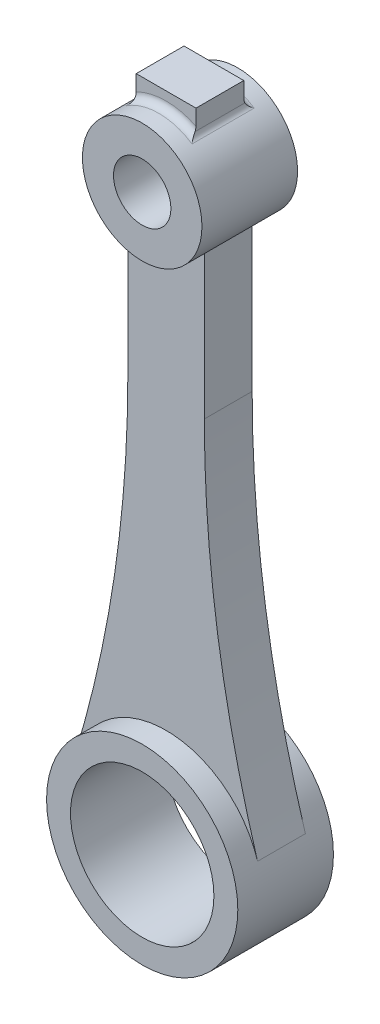
ISO-10303-21;
HEADER;
FILE_DESCRIPTION(('STEP AP214'),'2;1');
FILE_NAME('part.step','',(''),(''),'','','');
FILE_SCHEMA(('AUTOMOTIVE_DESIGN { 1 0 10303 214 1 1 1 1 }'));
ENDSEC;
DATA;
#1=APPLICATION_CONTEXT('core data for automotive mechanical design processes');
#2=APPLICATION_PROTOCOL_DEFINITION('international standard','automotive_design',2000,#1);
#3=PRODUCT_CONTEXT('',#1,'mechanical');
#4=PRODUCT('Part','Part','',(#3));
#5=PRODUCT_RELATED_PRODUCT_CATEGORY('part','',(#4));
#6=PRODUCT_DEFINITION_FORMATION('','',#4);
#7=PRODUCT_DEFINITION_CONTEXT('part definition',#1,'design');
#8=PRODUCT_DEFINITION('design','',#6,#7);
#9=PRODUCT_DEFINITION_SHAPE('','',#8);
#10=(LENGTH_UNIT() NAMED_UNIT(*) SI_UNIT(.MILLI.,.METRE.));
#11=(NAMED_UNIT(*) PLANE_ANGLE_UNIT() SI_UNIT($,.RADIAN.));
#12=(NAMED_UNIT(*) SI_UNIT($,.STERADIAN.) SOLID_ANGLE_UNIT());
#13=UNCERTAINTY_MEASURE_WITH_UNIT(LENGTH_MEASURE(1.E-05),#10,'distance_accuracy_value','');
#14=(GEOMETRIC_REPRESENTATION_CONTEXT(3) GLOBAL_UNCERTAINTY_ASSIGNED_CONTEXT((#13)) GLOBAL_UNIT_ASSIGNED_CONTEXT((#10,
#11,#12)) REPRESENTATION_CONTEXT('',''));
#15=CARTESIAN_POINT('',(0.,0.,0.));
#16=DIRECTION('',(0.,0.,1.));
#17=DIRECTION('',(1.,0.,0.));
#18=AXIS2_PLACEMENT_3D('',#15,#16,#17);
#19=CARTESIAN_POINT('',(0.,0.,10.));
#20=DIRECTION('',(0.,0.,1.));
#21=DIRECTION('',(1.,0.,0.));
#22=AXIS2_PLACEMENT_3D('',#19,#20,#21);
#23=PLANE('',#22);
#24=CARTESIAN_POINT('',(0.,0.,10.));
#25=DIRECTION('',(0.,0.,1.));
#26=DIRECTION('',(1.,0.,0.));
#27=AXIS2_PLACEMENT_3D('',#24,#25,#26);
#28=CIRCLE('',#27,20.);
#29=CARTESIAN_POINT('',(20.,0.,10.));
#30=VERTEX_POINT('',#29);
#31=EDGE_CURVE('E234',#30,#30,#28,.T.);
#32=ORIENTED_EDGE('',*,*,#31,.T.);
#33=EDGE_LOOP('',(#32));
#34=FACE_BOUND('',#33,.T.);
#35=CARTESIAN_POINT('',(0.,0.,10.));
#36=DIRECTION('',(0.,0.,1.));
#37=DIRECTION('',(1.,0.,0.));
#38=AXIS2_PLACEMENT_3D('',#35,#36,#37);
#39=CIRCLE('',#38,15.);
#40=CARTESIAN_POINT('',(15.,0.,10.));
#41=VERTEX_POINT('',#40);
#42=EDGE_CURVE('E228',#41,#41,#39,.T.);
#43=ORIENTED_EDGE('',*,*,#42,.F.);
#44=EDGE_LOOP('',(#43));
#45=FACE_BOUND('',#44,.T.);
#46=ADVANCED_FACE('F34',(#34,#45),#23,.T.);
#47=CARTESIAN_POINT('',(0.,0.,-10.));
#48=DIRECTION('',(0.,0.,1.));
#49=DIRECTION('',(1.,0.,0.));
#50=AXIS2_PLACEMENT_3D('',#47,#48,#49);
#51=PLANE('',#50);
#52=CARTESIAN_POINT('',(0.,0.,-10.));
#53=DIRECTION('',(0.,0.,1.));
#54=DIRECTION('',(1.,0.,0.));
#55=AXIS2_PLACEMENT_3D('',#52,#53,#54);
#56=CIRCLE('',#55,20.);
#57=CARTESIAN_POINT('',(20.,0.,-10.));
#58=VERTEX_POINT('',#57);
#59=EDGE_CURVE('E231',#58,#58,#56,.T.);
#60=ORIENTED_EDGE('',*,*,#59,.F.);
#61=EDGE_LOOP('',(#60));
#62=FACE_BOUND('',#61,.T.);
#63=CARTESIAN_POINT('',(0.,0.,-10.));
#64=DIRECTION('',(0.,0.,1.));
#65=DIRECTION('',(1.,0.,0.));
#66=AXIS2_PLACEMENT_3D('',#63,#64,#65);
#67=CIRCLE('',#66,15.);
#68=CARTESIAN_POINT('',(15.,0.,-10.));
#69=VERTEX_POINT('',#68);
#70=EDGE_CURVE('E227',#69,#69,#67,.T.);
#71=ORIENTED_EDGE('',*,*,#70,.T.);
#72=EDGE_LOOP('',(#71));
#73=FACE_BOUND('',#72,.T.);
#74=ADVANCED_FACE('F388',(#62,#73),#51,.F.);
#75=CARTESIAN_POINT('',(0.,0.,10.));
#76=DIRECTION('',(0.,0.,-1.));
#77=DIRECTION('',(-1.,0.,0.));
#78=AXIS2_PLACEMENT_3D('',#75,#76,#77);
#79=CYLINDRICAL_SURFACE('',#78,20.);
#80=DIRECTION('',(0.,0.,-1.));
#81=VECTOR('',#80,1.);
#82=CARTESIAN_POINT('',(19.1282509955381,5.84037788603577,5.));
#83=LINE('',#82,#81);
#84=CARTESIAN_POINT('',(19.1282509955381,5.84037788603577,5.));
#85=VERTEX_POINT('',#84);
#86=CARTESIAN_POINT('',(19.128250995538,5.84037788603575,-5.));
#87=VERTEX_POINT('',#86);
#88=EDGE_CURVE('E197',#85,#87,#83,.T.);
#89=ORIENTED_EDGE('',*,*,#88,.F.);
#90=CARTESIAN_POINT('',(0.,0.,5.));
#91=DIRECTION('',(0.,0.,-1.));
#92=DIRECTION('',(1.,0.,0.));
#93=AXIS2_PLACEMENT_3D('',#90,#91,#92);
#94=CIRCLE('',#93,20.);
#95=CARTESIAN_POINT('',(-19.1282509955381,5.84037788603577,5.));
#96=VERTEX_POINT('',#95);
#97=EDGE_CURVE('E194',#96,#85,#94,.T.);
#98=ORIENTED_EDGE('',*,*,#97,.F.);
#99=DIRECTION('',(0.,0.,-1.));
#100=VECTOR('',#99,1.);
#101=CARTESIAN_POINT('',(-19.128250995538,5.84037788603586,5.));
#102=LINE('',#101,#100);
#103=CARTESIAN_POINT('',(-19.128250995538,5.84037788603586,-5.));
#104=VERTEX_POINT('',#103);
#105=EDGE_CURVE('E213',#96,#104,#102,.T.);
#106=ORIENTED_EDGE('',*,*,#105,.T.);
#107=CARTESIAN_POINT('',(0.,0.,-5.));
#108=DIRECTION('',(0.,0.,-1.));
#109=DIRECTION('',(1.,0.,0.));
#110=AXIS2_PLACEMENT_3D('',#107,#108,#109);
#111=CIRCLE('',#110,20.);
#112=EDGE_CURVE('E185',#104,#87,#111,.T.);
#113=ORIENTED_EDGE('',*,*,#112,.T.);
#114=EDGE_LOOP('',(#89,#98,#106,#113));
#115=FACE_BOUND('',#114,.T.);
#116=ORIENTED_EDGE('',*,*,#31,.F.);
#117=EDGE_LOOP('',(#116));
#118=FACE_BOUND('',#117,.T.);
#119=ORIENTED_EDGE('',*,*,#59,.T.);
#120=EDGE_LOOP('',(#119));
#121=FACE_BOUND('',#120,.T.);
#122=ADVANCED_FACE('F384',(#115,#118,#121),#79,.T.);
#123=CARTESIAN_POINT('',(0.,0.,10.));
#124=DIRECTION('',(0.,0.,-1.));
#125=DIRECTION('',(-1.,0.,0.));
#126=AXIS2_PLACEMENT_3D('',#123,#124,#125);
#127=CYLINDRICAL_SURFACE('',#126,15.);
#128=ORIENTED_EDGE('',*,*,#42,.T.);
#129=EDGE_LOOP('',(#128));
#130=FACE_BOUND('',#129,.T.);
#131=ORIENTED_EDGE('',*,*,#70,.F.);
#132=EDGE_LOOP('',(#131));
#133=FACE_BOUND('',#132,.T.);
#134=ADVANCED_FACE('F380',(#130,#133),#127,.F.);
#135=CARTESIAN_POINT('',(263.308602328881,80.3953136438508,5.));
#136=DIRECTION('',(0.,0.,-1.));
#137=DIRECTION('',(-1.,0.,0.));
#138=AXIS2_PLACEMENT_3D('',#135,#136,#137);
#139=CYLINDRICAL_SURFACE('',#138,255.308602328881);
#140=CARTESIAN_POINT('',(263.308602328881,80.3953136438508,-5.));
#141=DIRECTION('',(0.,0.,-1.));
#142=DIRECTION('',(1.,0.,0.));
#143=AXIS2_PLACEMENT_3D('',#140,#141,#142);
#144=CIRCLE('',#143,255.308602328881);
#145=CARTESIAN_POINT('',(8.00000000000001,80.3953136438507,-5.));
#146=VERTEX_POINT('',#145);
#147=EDGE_CURVE('E178',#87,#146,#144,.T.);
#148=ORIENTED_EDGE('',*,*,#147,.T.);
#149=DIRECTION('',(0.,0.,-1.));
#150=VECTOR('',#149,1.);
#151=CARTESIAN_POINT('',(8.00000000000001,80.3953136438507,5.));
#152=LINE('',#151,#150);
#153=CARTESIAN_POINT('',(8.00000000000001,80.3953136438507,5.));
#154=VERTEX_POINT('',#153);
#155=EDGE_CURVE('E224',#154,#146,#152,.T.);
#156=ORIENTED_EDGE('',*,*,#155,.F.);
#157=CARTESIAN_POINT('',(263.308602328881,80.3953136438508,5.));
#158=DIRECTION('',(0.,0.,-1.));
#159=DIRECTION('',(1.,0.,0.));
#160=AXIS2_PLACEMENT_3D('',#157,#158,#159);
#161=CIRCLE('',#160,255.308602328881);
#162=EDGE_CURVE('E181',#85,#154,#161,.T.);
#163=ORIENTED_EDGE('',*,*,#162,.F.);
#164=ORIENTED_EDGE('',*,*,#88,.T.);
#165=EDGE_LOOP('',(#148,#156,#163,#164));
#166=FACE_BOUND('',#165,.T.);
#167=ADVANCED_FACE('F376',(#166),#139,.F.);
#168=CARTESIAN_POINT('',(8.,110.395313643851,5.));
#169=DIRECTION('',(-1.,0.,0.));
#170=DIRECTION('',(0.,-1.,0.));
#171=AXIS2_PLACEMENT_3D('',#168,#169,#170);
#172=PLANE('',#171);
#173=DIRECTION('',(0.,1.,0.));
#174=VECTOR('',#173,1.);
#175=CARTESIAN_POINT('',(8.,110.395313643851,-5.));
#176=LINE('',#175,#174);
#177=CARTESIAN_POINT('',(8.,110.395313643851,-5.));
#178=VERTEX_POINT('',#177);
#179=EDGE_CURVE('E200',#146,#178,#176,.T.);
#180=ORIENTED_EDGE('',*,*,#179,.T.);
#181=DIRECTION('',(0.,0.,-1.));
#182=VECTOR('',#181,1.);
#183=CARTESIAN_POINT('',(8.,110.395313643851,5.));
#184=LINE('',#183,#182);
#185=CARTESIAN_POINT('',(8.,110.395313643851,5.));
#186=VERTEX_POINT('',#185);
#187=EDGE_CURVE('E221',#186,#178,#184,.T.);
#188=ORIENTED_EDGE('',*,*,#187,.F.);
#189=DIRECTION('',(0.,1.,0.));
#190=VECTOR('',#189,1.);
#191=CARTESIAN_POINT('',(8.,110.395313643851,5.));
#192=LINE('',#191,#190);
#193=EDGE_CURVE('E184',#154,#186,#192,.T.);
#194=ORIENTED_EDGE('',*,*,#193,.F.);
#195=ORIENTED_EDGE('',*,*,#155,.T.);
#196=EDGE_LOOP('',(#180,#188,#194,#195));
#197=FACE_BOUND('',#196,.T.);
#198=ADVANCED_FACE('F372',(#197),#172,.F.);
#199=CARTESIAN_POINT('',(-8.,110.395313643851,5.));
#200=DIRECTION('',(1.,0.,0.));
#201=DIRECTION('',(0.,1.,0.));
#202=AXIS2_PLACEMENT_3D('',#199,#200,#201);
#203=PLANE('',#202);
#204=DIRECTION('',(0.,-1.,0.));
#205=VECTOR('',#204,1.);
#206=CARTESIAN_POINT('',(-8.,110.395313643851,-5.));
#207=LINE('',#206,#205);
#208=CARTESIAN_POINT('',(-8.,110.395313643851,-5.));
#209=VERTEX_POINT('',#208);
#210=CARTESIAN_POINT('',(-8.00000000000001,80.3953136438507,-5.));
#211=VERTEX_POINT('',#210);
#212=EDGE_CURVE('E205',#209,#211,#207,.T.);
#213=ORIENTED_EDGE('',*,*,#212,.T.);
#214=DIRECTION('',(0.,0.,-1.));
#215=VECTOR('',#214,1.);
#216=CARTESIAN_POINT('',(-8.00000000000001,80.3953136438507,5.));
#217=LINE('',#216,#215);
#218=CARTESIAN_POINT('',(-8.00000000000001,80.3953136438507,5.));
#219=VERTEX_POINT('',#218);
#220=EDGE_CURVE('E215',#219,#211,#217,.T.);
#221=ORIENTED_EDGE('',*,*,#220,.F.);
#222=DIRECTION('',(0.,-1.,0.));
#223=VECTOR('',#222,1.);
#224=CARTESIAN_POINT('',(-8.,110.395313643851,5.));
#225=LINE('',#224,#223);
#226=CARTESIAN_POINT('',(-8.,110.395313643851,5.));
#227=VERTEX_POINT('',#226);
#228=EDGE_CURVE('E189',#227,#219,#225,.T.);
#229=ORIENTED_EDGE('',*,*,#228,.F.);
#230=DIRECTION('',(0.,0.,-1.));
#231=VECTOR('',#230,1.);
#232=CARTESIAN_POINT('',(-8.,110.395313643851,5.));
#233=LINE('',#232,#231);
#234=EDGE_CURVE('E218',#227,#209,#233,.T.);
#235=ORIENTED_EDGE('',*,*,#234,.T.);
#236=EDGE_LOOP('',(#213,#221,#229,#235));
#237=FACE_BOUND('',#236,.T.);
#238=ADVANCED_FACE('F368',(#237),#203,.F.);
#239=CARTESIAN_POINT('',(-263.308602328881,80.3953136438508,5.));
#240=DIRECTION('',(0.,0.,-1.));
#241=DIRECTION('',(-1.,0.,0.));
#242=AXIS2_PLACEMENT_3D('',#239,#240,#241);
#243=CYLINDRICAL_SURFACE('',#242,255.308602328881);
#244=CARTESIAN_POINT('',(-263.308602328881,80.3953136438508,-5.));
#245=DIRECTION('',(0.,0.,-1.));
#246=DIRECTION('',(-1.,0.,0.));
#247=AXIS2_PLACEMENT_3D('',#244,#245,#246);
#248=CIRCLE('',#247,255.308602328881);
#249=EDGE_CURVE('E207',#211,#104,#248,.T.);
#250=ORIENTED_EDGE('',*,*,#249,.T.);
#251=ORIENTED_EDGE('',*,*,#105,.F.);
#252=CARTESIAN_POINT('',(-263.308602328881,80.3953136438508,5.));
#253=DIRECTION('',(0.,0.,-1.));
#254=DIRECTION('',(-1.,0.,0.));
#255=AXIS2_PLACEMENT_3D('',#252,#253,#254);
#256=CIRCLE('',#255,255.308602328881);
#257=EDGE_CURVE('E191',#219,#96,#256,.T.);
#258=ORIENTED_EDGE('',*,*,#257,.F.);
#259=ORIENTED_EDGE('',*,*,#220,.T.);
#260=EDGE_LOOP('',(#250,#251,#258,#259));
#261=FACE_BOUND('',#260,.T.);
#262=ADVANCED_FACE('F361',(#261),#243,.F.);
#263=CARTESIAN_POINT('',(263.308602328881,80.3953136438508,5.));
#264=DIRECTION('',(0.,0.,1.));
#265=DIRECTION('',(1.,0.,0.));
#266=AXIS2_PLACEMENT_3D('',#263,#264,#265);
#267=PLANE('',#266);
#268=ORIENTED_EDGE('',*,*,#162,.T.);
#269=ORIENTED_EDGE('',*,*,#193,.T.);
#270=CARTESIAN_POINT('',(0.,120.,5.));
#271=DIRECTION('',(0.,0.,-1.));
#272=DIRECTION('',(1.,0.,0.));
#273=AXIS2_PLACEMENT_3D('',#270,#271,#272);
#274=CIRCLE('',#273,12.5);
#275=EDGE_CURVE('E187',#186,#227,#274,.T.);
#276=ORIENTED_EDGE('',*,*,#275,.T.);
#277=ORIENTED_EDGE('',*,*,#228,.T.);
#278=ORIENTED_EDGE('',*,*,#257,.T.);
#279=ORIENTED_EDGE('',*,*,#97,.T.);
#280=EDGE_LOOP('',(#268,#269,#276,#277,#278,#279));
#281=FACE_BOUND('',#280,.T.);
#282=ADVANCED_FACE('F358',(#281),#267,.T.);
#283=CARTESIAN_POINT('',(263.308602328881,80.3953136438508,-5.));
#284=DIRECTION('',(0.,0.,1.));
#285=DIRECTION('',(1.,0.,0.));
#286=AXIS2_PLACEMENT_3D('',#283,#284,#285);
#287=PLANE('',#286);
#288=ORIENTED_EDGE('',*,*,#147,.F.);
#289=ORIENTED_EDGE('',*,*,#112,.F.);
#290=ORIENTED_EDGE('',*,*,#249,.F.);
#291=ORIENTED_EDGE('',*,*,#212,.F.);
#292=CARTESIAN_POINT('',(0.,120.,-5.));
#293=DIRECTION('',(0.,0.,-1.));
#294=DIRECTION('',(1.,0.,0.));
#295=AXIS2_PLACEMENT_3D('',#292,#293,#294);
#296=CIRCLE('',#295,12.5);
#297=EDGE_CURVE('E202',#178,#209,#296,.T.);
#298=ORIENTED_EDGE('',*,*,#297,.F.);
#299=ORIENTED_EDGE('',*,*,#179,.F.);
#300=EDGE_LOOP('',(#288,#289,#290,#291,#298,#299));
#301=FACE_BOUND('',#300,.T.);
#302=ADVANCED_FACE('F351',(#301),#287,.F.);
#303=CARTESIAN_POINT('',(0.,120.,10.));
#304=DIRECTION('',(0.,0.,1.));
#305=DIRECTION('',(1.,0.,0.));
#306=AXIS2_PLACEMENT_3D('',#303,#304,#305);
#307=PLANE('',#306);
#308=CARTESIAN_POINT('',(0.,120.,10.));
#309=DIRECTION('',(0.,0.,1.));
#310=DIRECTION('',(1.,0.,0.));
#311=AXIS2_PLACEMENT_3D('',#308,#309,#310);
#312=CIRCLE('',#311,12.5);
#313=CARTESIAN_POINT('',(12.5,120.,10.));
#314=VERTEX_POINT('',#313);
#315=EDGE_CURVE('E175',#314,#314,#312,.T.);
#316=ORIENTED_EDGE('',*,*,#315,.T.);
#317=EDGE_LOOP('',(#316));
#318=FACE_BOUND('',#317,.T.);
#319=CARTESIAN_POINT('',(0.,120.,10.));
#320=DIRECTION('',(0.,0.,1.));
#321=DIRECTION('',(1.,0.,0.));
#322=AXIS2_PLACEMENT_3D('',#319,#320,#321);
#323=CIRCLE('',#322,6.);
#324=CARTESIAN_POINT('',(6.,120.,10.));
#325=VERTEX_POINT('',#324);
#326=EDGE_CURVE('E167',#325,#325,#323,.T.);
#327=ORIENTED_EDGE('',*,*,#326,.F.);
#328=EDGE_LOOP('',(#327));
#329=FACE_BOUND('',#328,.T.);
#330=ADVANCED_FACE('F347',(#318,#329),#307,.T.);
#331=CARTESIAN_POINT('',(0.,120.,-10.));
#332=DIRECTION('',(0.,0.,1.));
#333=DIRECTION('',(1.,0.,0.));
#334=AXIS2_PLACEMENT_3D('',#331,#332,#333);
#335=PLANE('',#334);
#336=CARTESIAN_POINT('',(0.,120.,-10.));
#337=DIRECTION('',(0.,0.,1.));
#338=DIRECTION('',(1.,0.,0.));
#339=AXIS2_PLACEMENT_3D('',#336,#337,#338);
#340=CIRCLE('',#339,12.5);
#341=CARTESIAN_POINT('',(12.5,120.,-10.));
#342=VERTEX_POINT('',#341);
#343=EDGE_CURVE('E173',#342,#342,#340,.T.);
#344=ORIENTED_EDGE('',*,*,#343,.F.);
#345=EDGE_LOOP('',(#344));
#346=FACE_BOUND('',#345,.T.);
#347=CARTESIAN_POINT('',(0.,120.,-10.));
#348=DIRECTION('',(0.,0.,1.));
#349=DIRECTION('',(1.,0.,0.));
#350=AXIS2_PLACEMENT_3D('',#347,#348,#349);
#351=CIRCLE('',#350,6.);
#352=CARTESIAN_POINT('',(6.,120.,-10.));
#353=VERTEX_POINT('',#352);
#354=EDGE_CURVE('E163',#353,#353,#351,.T.);
#355=ORIENTED_EDGE('',*,*,#354,.T.);
#356=EDGE_LOOP('',(#355));
#357=FACE_BOUND('',#356,.T.);
#358=ADVANCED_FACE('F350',(#346,#357),#335,.F.);
#359=CARTESIAN_POINT('',(0.,120.,10.));
#360=DIRECTION('',(0.,0.,-1.));
#361=DIRECTION('',(-1.,0.,0.));
#362=AXIS2_PLACEMENT_3D('',#359,#360,#361);
#363=CYLINDRICAL_SURFACE('',#362,12.5);
#364=CARTESIAN_POINT('',(0.,120.,6.5));
#365=DIRECTION('',(0.,0.,1.));
#366=DIRECTION('',(1.,0.,0.));
#367=AXIS2_PLACEMENT_3D('',#364,#365,#366);
#368=CIRCLE('',#367,12.5);
#369=CARTESIAN_POINT('',(6.91964285714287,130.410021264608,6.5));
#370=VERTEX_POINT('',#369);
#371=CARTESIAN_POINT('',(-6.91964285714287,130.410021264608,6.5));
#372=VERTEX_POINT('',#371);
#373=EDGE_CURVE('E241',#370,#372,#368,.T.);
#374=ORIENTED_EDGE('',*,*,#373,.T.);
#375=DIRECTION('',(0.,0.,-1.));
#376=VECTOR('',#375,1.);
#377=CARTESIAN_POINT('',(-6.91964285714287,130.410021264608,10.));
#378=LINE('',#377,#376);
#379=CARTESIAN_POINT('',(-6.91964285714287,130.410021264608,-6.5));
#380=VERTEX_POINT('',#379);
#381=EDGE_CURVE('E245',#372,#380,#378,.T.);
#382=ORIENTED_EDGE('',*,*,#381,.T.);
#383=CARTESIAN_POINT('',(0.,120.,-6.5));
#384=DIRECTION('',(0.,0.,1.));
#385=DIRECTION('',(1.,0.,0.));
#386=AXIS2_PLACEMENT_3D('',#383,#384,#385);
#387=CIRCLE('',#386,12.5);
#388=CARTESIAN_POINT('',(6.91964285714287,130.410021264608,-6.5));
#389=VERTEX_POINT('',#388);
#390=EDGE_CURVE('E243',#380,#389,#387,.F.);
#391=ORIENTED_EDGE('',*,*,#390,.T.);
#392=DIRECTION('',(0.,0.,-1.));
#393=VECTOR('',#392,1.);
#394=CARTESIAN_POINT('',(6.91964285714287,130.410021264608,10.));
#395=LINE('',#394,#393);
#396=EDGE_CURVE('E237',#389,#370,#395,.F.);
#397=ORIENTED_EDGE('',*,*,#396,.T.);
#398=EDGE_LOOP('',(#374,#382,#391,#397));
#399=FACE_BOUND('',#398,.T.);
#400=ORIENTED_EDGE('',*,*,#275,.F.);
#401=ORIENTED_EDGE('',*,*,#187,.T.);
#402=ORIENTED_EDGE('',*,*,#297,.T.);
#403=ORIENTED_EDGE('',*,*,#234,.F.);
#404=EDGE_LOOP('',(#400,#401,#402,#403));
#405=FACE_BOUND('',#404,.T.);
#406=ORIENTED_EDGE('',*,*,#315,.F.);
#407=EDGE_LOOP('',(#406));
#408=FACE_BOUND('',#407,.T.);
#409=ORIENTED_EDGE('',*,*,#343,.T.);
#410=EDGE_LOOP('',(#409));
#411=FACE_BOUND('',#410,.T.);
#412=ADVANCED_FACE('F315',(#399,#405,#408,#411),#363,.T.);
#413=CARTESIAN_POINT('',(0.,120.,10.));
#414=DIRECTION('',(0.,0.,-1.));
#415=DIRECTION('',(-1.,0.,0.));
#416=AXIS2_PLACEMENT_3D('',#413,#414,#415);
#417=CYLINDRICAL_SURFACE('',#416,6.);
#418=ORIENTED_EDGE('',*,*,#326,.T.);
#419=EDGE_LOOP('',(#418));
#420=FACE_BOUND('',#419,.T.);
#421=ORIENTED_EDGE('',*,*,#354,.F.);
#422=EDGE_LOOP('',(#421));
#423=FACE_BOUND('',#422,.T.);
#424=ADVANCED_FACE('F343',(#420,#423),#417,.F.);
#425=CARTESIAN_POINT('',(-6.25000000000002,135.825317547305,5.));
#426=DIRECTION('',(0.,-1.,0.));
#427=DIRECTION('',(0.,0.,-1.));
#428=AXIS2_PLACEMENT_3D('',#425,#426,#427);
#429=PLANE('',#428);
#430=DIRECTION('',(-1.,0.,0.));
#431=VECTOR('',#430,1.);
#432=CARTESIAN_POINT('',(-6.25000000000002,135.825317547305,-5.));
#433=LINE('',#432,#431);
#434=CARTESIAN_POINT('',(6.24999999999998,135.825317547305,-5.));
#435=VERTEX_POINT('',#434);
#436=CARTESIAN_POINT('',(-6.25000000000002,135.825317547305,-5.));
#437=VERTEX_POINT('',#436);
#438=EDGE_CURVE('E162',#435,#437,#433,.T.);
#439=ORIENTED_EDGE('',*,*,#438,.T.);
#440=DIRECTION('',(0.,0.,-1.));
#441=VECTOR('',#440,1.);
#442=CARTESIAN_POINT('',(-6.25000000000002,135.825317547305,5.));
#443=LINE('',#442,#441);
#444=CARTESIAN_POINT('',(-6.25000000000002,135.825317547305,5.));
#445=VERTEX_POINT('',#444);
#446=EDGE_CURVE('E144',#445,#437,#443,.T.);
#447=ORIENTED_EDGE('',*,*,#446,.F.);
#448=DIRECTION('',(-1.,0.,0.));
#449=VECTOR('',#448,1.);
#450=CARTESIAN_POINT('',(-6.25000000000002,135.825317547305,5.));
#451=LINE('',#450,#449);
#452=CARTESIAN_POINT('',(6.24999999999998,135.825317547305,5.));
#453=VERTEX_POINT('',#452);
#454=EDGE_CURVE('E150',#453,#445,#451,.T.);
#455=ORIENTED_EDGE('',*,*,#454,.F.);
#456=DIRECTION('',(0.,0.,-1.));
#457=VECTOR('',#456,1.);
#458=CARTESIAN_POINT('',(6.24999999999998,135.825317547305,5.));
#459=LINE('',#458,#457);
#460=EDGE_CURVE('E164',#453,#435,#459,.T.);
#461=ORIENTED_EDGE('',*,*,#460,.T.);
#462=EDGE_LOOP('',(#439,#447,#455,#461));
#463=FACE_BOUND('',#462,.T.);
#464=ADVANCED_FACE('F160',(#463),#429,.F.);
#465=CARTESIAN_POINT('',(-6.25000000000002,135.825317547305,5.));
#466=DIRECTION('',(1.,0.,0.));
#467=DIRECTION('',(0.,1.,0.));
#468=AXIS2_PLACEMENT_3D('',#465,#466,#467);
#469=PLANE('',#468);
#470=DIRECTION('',(0.,-1.,0.));
#471=VECTOR('',#470,1.);
#472=CARTESIAN_POINT('',(-6.25000000000002,135.825317547305,-5.));
#473=LINE('',#472,#471);
#474=CARTESIAN_POINT('',(-6.25000000000002,132.527469816367,-5.));
#475=VERTEX_POINT('',#474);
#476=EDGE_CURVE('E324',#437,#475,#473,.T.);
#477=ORIENTED_EDGE('',*,*,#476,.T.);
#478=CARTESIAN_POINT('',(-6.25000000000129,132.527469816367,-5.));
#479=CARTESIAN_POINT('',(-6.25000000000046,132.421474584728,-4.99995476685734));
#480=CARTESIAN_POINT('',(-6.25000000000013,132.315375625552,-5.00899530953789));
#481=CARTESIAN_POINT('',(-6.24999999999991,132.108309727727,-5.04438410573177));
#482=CARTESIAN_POINT('',(-6.25,132.007282481463,-5.07038043253437));
#483=CARTESIAN_POINT('',(-6.25000000000003,131.866465757431,-5.11955531131258));
#484=CARTESIAN_POINT('',(-6.25000000000002,131.824266958783,-5.13605757336144));
#485=CARTESIAN_POINT('',(-6.25000000000001,131.740846367429,-5.17232225321434));
#486=CARTESIAN_POINT('',(-6.25000000000001,131.699636664042,-5.19211246740856));
#487=CARTESIAN_POINT('',(-6.25000000000002,131.659223816361,-5.21346063058965));
#488=B_SPLINE_CURVE_WITH_KNOTS('',3,(#478,#479,#480,#481,#482,#483,#484,#485,#486,#487),
.UNSPECIFIED.,.F.,.F.,(4,2,2,2,4),(0.,0.317817238810132,0.629239350438666,0.765064192464121,
0.902101912336235),.UNSPECIFIED.);
#489=CARTESIAN_POINT('',(-6.25000000000002,131.659223816361,-5.21346063058952));
#490=VERTEX_POINT('',#489);
#491=EDGE_CURVE('E263',#475,#490,#488,.T.);
#492=ORIENTED_EDGE('',*,*,#491,.T.);
#493=DIRECTION('',(0.,0.,1.));
#494=VECTOR('',#493,1.);
#495=CARTESIAN_POINT('',(-6.25000000000002,131.659223816361,5.));
#496=LINE('',#495,#494);
#497=CARTESIAN_POINT('',(-6.25000000000002,131.659223816361,5.21346063058952));
#498=VERTEX_POINT('',#497);
#499=EDGE_CURVE('E248',#490,#498,#496,.T.);
#500=ORIENTED_EDGE('',*,*,#499,.T.);
#501=CARTESIAN_POINT('',(-6.25000000000002,131.659223816361,5.21346063058952));
#502=CARTESIAN_POINT('',(-6.25000000000002,131.752311191975,5.16424446032767));
#503=CARTESIAN_POINT('',(-6.25000000000002,131.849761219296,5.12332058684711));
#504=CARTESIAN_POINT('',(-6.25000000000002,132.048204621925,5.05916061918915));
#505=CARTESIAN_POINT('',(-6.25000000000002,132.149090060202,5.03559127533277));
#506=CARTESIAN_POINT('',(-6.25000000000002,132.296653143681,5.01366539711515));
#507=CARTESIAN_POINT('',(-6.25000000000002,132.342414489118,5.00857452701163));
#508=CARTESIAN_POINT('',(-6.25000000000002,132.434598455898,5.00172830380905));
#509=CARTESIAN_POINT('',(-6.25000000000002,132.481023328131,5.00000325315169));
#510=CARTESIAN_POINT('',(-6.25000000000002,132.527469816367,4.99999999999997));
#511=B_SPLINE_CURVE_WITH_KNOTS('',3,(#501,#502,#503,#504,#505,#506,#507,#508,#509,#510),
.UNSPECIFIED.,.F.,.F.,(4,2,2,2,4),(0.,0.315516394441633,0.624803717398757,0.762831525218306,
0.90209636453908),.UNSPECIFIED.);
#512=CARTESIAN_POINT('',(-6.25000000000002,132.527469816367,5.));
#513=VERTEX_POINT('',#512);
#514=EDGE_CURVE('E11',#498,#513,#511,.T.);
#515=ORIENTED_EDGE('',*,*,#514,.T.);
#516=DIRECTION('',(0.,-1.,0.));
#517=VECTOR('',#516,1.);
#518=CARTESIAN_POINT('',(-6.25000000000002,135.825317547305,5.));
#519=LINE('',#518,#517);
#520=EDGE_CURVE('E139',#445,#513,#519,.T.);
#521=ORIENTED_EDGE('',*,*,#520,.F.);
#522=ORIENTED_EDGE('',*,*,#446,.T.);
#523=EDGE_LOOP('',(#477,#492,#500,#515,#521,#522));
#524=FACE_BOUND('',#523,.T.);
#525=ADVANCED_FACE('F142',(#524),#469,.F.);
#526=CARTESIAN_POINT('',(6.24999999999998,135.825317547305,5.));
#527=DIRECTION('',(-1.,0.,0.));
#528=DIRECTION('',(0.,-1.,0.));
#529=AXIS2_PLACEMENT_3D('',#526,#527,#528);
#530=PLANE('',#529);
#531=CARTESIAN_POINT('',(6.25000000000001,132.527469816368,5.));
#532=CARTESIAN_POINT('',(6.25000000000001,132.421474584729,4.99995476685731));
#533=CARTESIAN_POINT('',(6.25000000000001,132.315375625552,5.00899530953784));
#534=CARTESIAN_POINT('',(6.25000000000001,132.108309727727,5.0443841057317));
#535=CARTESIAN_POINT('',(6.25000000000001,132.007282481463,5.07038043253431));
#536=CARTESIAN_POINT('',(6.25000000000001,131.866465757431,5.11955531131255));
#537=CARTESIAN_POINT('',(6.25000000000001,131.824266958783,5.13605757336141));
#538=CARTESIAN_POINT('',(6.25000000000001,131.740846367429,5.17232225321432));
#539=CARTESIAN_POINT('',(6.25000000000002,131.699636664042,5.19211246740855));
#540=CARTESIAN_POINT('',(6.25000000000002,131.659223816361,5.21346063058965));
#541=B_SPLINE_CURVE_WITH_KNOTS('',3,(#531,#532,#533,#534,#535,#536,#537,#538,#539,#540),
.UNSPECIFIED.,.F.,.F.,(4,2,2,2,4),(0.,0.317817238810432,0.629239350439185,0.765064192464698,
0.902101912336871),.UNSPECIFIED.);
#542=CARTESIAN_POINT('',(6.25000000000001,132.527469816368,5.));
#543=VERTEX_POINT('',#542);
#544=CARTESIAN_POINT('',(6.25000000000002,131.659223816361,5.21346063058952));
#545=VERTEX_POINT('',#544);
#546=EDGE_CURVE('E48',#543,#545,#541,.T.);
#547=ORIENTED_EDGE('',*,*,#546,.T.);
#548=DIRECTION('',(0.,0.,1.));
#549=VECTOR('',#548,1.);
#550=CARTESIAN_POINT('',(6.25000000000002,131.659223816361,-5.));
#551=LINE('',#550,#549);
#552=CARTESIAN_POINT('',(6.25000000000002,131.659223816361,-5.21346063058952));
#553=VERTEX_POINT('',#552);
#554=EDGE_CURVE('E56',#545,#553,#551,.F.);
#555=ORIENTED_EDGE('',*,*,#554,.T.);
#556=CARTESIAN_POINT('',(6.25000000000002,131.659223816361,-5.21346063058952));
#557=CARTESIAN_POINT('',(6.25000000000001,131.752311191975,-5.16424446032767));
#558=CARTESIAN_POINT('',(6.25000000000001,131.849761219296,-5.12332058684711));
#559=CARTESIAN_POINT('',(6.25000000000001,132.048204621925,-5.05916061918915));
#560=CARTESIAN_POINT('',(6.25000000000001,132.149090060202,-5.03559127533277));
#561=CARTESIAN_POINT('',(6.25000000000001,132.296653143681,-5.01366539711513));
#562=CARTESIAN_POINT('',(6.25000000000001,132.342414489118,-5.00857452701161));
#563=CARTESIAN_POINT('',(6.25000000000001,132.434598455899,-5.00172830380903));
#564=CARTESIAN_POINT('',(6.25000000000001,132.481023328132,-5.00000325315167));
#565=CARTESIAN_POINT('',(6.25000000000001,132.527469816368,-4.99999999999997));
#566=B_SPLINE_CURVE_WITH_KNOTS('',3,(#556,#557,#558,#559,#560,#561,#562,#563,#564,#565),
.UNSPECIFIED.,.F.,.F.,(4,2,2,2,4),(0.,0.315516394441633,0.624803717398757,0.762831525218613,
0.90209636453969),.UNSPECIFIED.);
#567=CARTESIAN_POINT('',(6.25000000000001,132.527469816368,-5.));
#568=VERTEX_POINT('',#567);
#569=EDGE_CURVE('E255',#553,#568,#566,.T.);
#570=ORIENTED_EDGE('',*,*,#569,.T.);
#571=DIRECTION('',(0.,1.,0.));
#572=VECTOR('',#571,1.);
#573=CARTESIAN_POINT('',(6.24999999999998,135.825317547305,-5.));
#574=LINE('',#573,#572);
#575=EDGE_CURVE('E158',#568,#435,#574,.T.);
#576=ORIENTED_EDGE('',*,*,#575,.T.);
#577=ORIENTED_EDGE('',*,*,#460,.F.);
#578=DIRECTION('',(0.,1.,0.));
#579=VECTOR('',#578,1.);
#580=CARTESIAN_POINT('',(6.24999999999998,135.825317547305,5.));
#581=LINE('',#580,#579);
#582=EDGE_CURVE('E149',#543,#453,#581,.T.);
#583=ORIENTED_EDGE('',*,*,#582,.F.);
#584=EDGE_LOOP('',(#547,#555,#570,#576,#577,#583));
#585=FACE_BOUND('',#584,.T.);
#586=ADVANCED_FACE('F270',(#585),#530,.F.);
#587=CARTESIAN_POINT('',(0.,120.,5.));
#588=DIRECTION('',(0.,0.,1.));
#589=DIRECTION('',(1.,0.,0.));
#590=AXIS2_PLACEMENT_3D('',#587,#588,#589);
#591=PLANE('',#590);
#592=ORIENTED_EDGE('',*,*,#520,.T.);
#593=CARTESIAN_POINT('',(0.,120.,5.));
#594=DIRECTION('',(0.,0.,1.));
#595=DIRECTION('',(1.,0.,0.));
#596=AXIS2_PLACEMENT_3D('',#593,#594,#595);
#597=CIRCLE('',#596,14.);
#598=EDGE_CURVE('E252',#513,#543,#597,.F.);
#599=ORIENTED_EDGE('',*,*,#598,.T.);
#600=ORIENTED_EDGE('',*,*,#582,.T.);
#601=ORIENTED_EDGE('',*,*,#454,.T.);
#602=EDGE_LOOP('',(#592,#599,#600,#601));
#603=FACE_BOUND('',#602,.T.);
#604=ADVANCED_FACE('F153',(#603),#591,.T.);
#605=CARTESIAN_POINT('',(0.,120.,-5.));
#606=DIRECTION('',(0.,0.,1.));
#607=DIRECTION('',(1.,0.,0.));
#608=AXIS2_PLACEMENT_3D('',#605,#606,#607);
#609=PLANE('',#608);
#610=ORIENTED_EDGE('',*,*,#575,.F.);
#611=CARTESIAN_POINT('',(0.,120.,-5.));
#612=DIRECTION('',(0.,0.,1.));
#613=DIRECTION('',(1.,0.,0.));
#614=AXIS2_PLACEMENT_3D('',#611,#612,#613);
#615=CIRCLE('',#614,14.);
#616=EDGE_CURVE('E250',#568,#475,#615,.T.);
#617=ORIENTED_EDGE('',*,*,#616,.T.);
#618=ORIENTED_EDGE('',*,*,#476,.F.);
#619=ORIENTED_EDGE('',*,*,#438,.F.);
#620=EDGE_LOOP('',(#610,#617,#618,#619));
#621=FACE_BOUND('',#620,.T.);
#622=ADVANCED_FACE('F328',(#621),#609,.F.);
#623=CARTESIAN_POINT('',(7.75000000000002,131.659223816361,10.));
#624=DIRECTION('',(0.,0.,-1.));
#625=DIRECTION('',(-1.,0.,0.));
#626=AXIS2_PLACEMENT_3D('',#623,#624,#625);
#627=CYLINDRICAL_SURFACE('',#626,1.5);
#628=ORIENTED_EDGE('',*,*,#554,.F.);
#629=CARTESIAN_POINT('',(6.25000000000002,131.659223816361,5.21346063058952));
#630=CARTESIAN_POINT('',(6.2500063854588,131.612332008452,5.2382390970095));
#631=CARTESIAN_POINT('',(6.25219748490573,131.566347766414,5.26458128424851));
#632=CARTESIAN_POINT('',(6.2604926178623,131.476455941514,5.31984819830485));
#633=CARTESIAN_POINT('',(6.26658799954839,131.432543996913,5.34876709349817));
#634=CARTESIAN_POINT('',(6.28993313157369,131.304723531496,5.43824617056945));
#635=CARTESIAN_POINT('',(6.31225758029675,131.22393813967,5.50196130038864));
#636=CARTESIAN_POINT('',(6.37743349045801,131.044271220488,5.65836916740769));
#637=CARTESIAN_POINT('',(6.4247488085142,130.949065472676,5.75335270154145));
#638=CARTESIAN_POINT('',(6.53448577221973,130.774229749857,5.94909271503378));
#639=CARTESIAN_POINT('',(6.59696099403628,130.694656868529,6.04986867933677));
#640=CARTESIAN_POINT('',(6.7416589573725,130.543274670194,6.26507617263487));
#641=CARTESIAN_POINT('',(6.82528156078008,130.473215502851,6.37981236829729));
#642=CARTESIAN_POINT('',(6.9166910022573,130.411987182845,6.49624664618255));
#643=CARTESIAN_POINT('',(6.91816608526864,130.411002905504,6.49812335109172));
#644=CARTESIAN_POINT('',(6.91964285714288,130.410021264608,6.5));
#645=B_SPLINE_CURVE_WITH_KNOTS('',3,(#629,#630,#631,#632,#633,#634,#635,#636,#637,#638,#639,
#640,#641,#642,#643,#644),.UNSPECIFIED.,.F.,.F.,(4,2,2,2,2,2,2,4),(0.,0.158921145922187,
0.317491337925636,0.631963862353099,1.0574219936334,1.48440620162472,1.95722254786928,
1.96496852030664),.UNSPECIFIED.);
#646=EDGE_CURVE('E39',#370,#545,#645,.F.);
#647=ORIENTED_EDGE('',*,*,#646,.F.);
#648=ORIENTED_EDGE('',*,*,#396,.F.);
#649=CARTESIAN_POINT('',(6.25000000000002,131.659223816361,-5.21346063058952));
#650=CARTESIAN_POINT('',(6.2500063854588,131.612332008452,-5.2382390970095));
#651=CARTESIAN_POINT('',(6.25219748490573,131.566347766414,-5.26458128424851));
#652=CARTESIAN_POINT('',(6.2604926178623,131.476455941514,-5.31984819830485));
#653=CARTESIAN_POINT('',(6.26658799954839,131.432543996913,-5.34876709349817));
#654=CARTESIAN_POINT('',(6.28993313157369,131.304723531496,-5.43824617056945));
#655=CARTESIAN_POINT('',(6.31225758029675,131.22393813967,-5.50196130038864));
#656=CARTESIAN_POINT('',(6.37743349045801,131.044271220488,-5.65836916740769));
#657=CARTESIAN_POINT('',(6.4247488085142,130.949065472676,-5.75335270154145));
#658=CARTESIAN_POINT('',(6.53448577221973,130.774229749857,-5.94909271503378));
#659=CARTESIAN_POINT('',(6.59696099403628,130.694656868529,-6.04986867933677));
#660=CARTESIAN_POINT('',(6.7416589573725,130.543274670194,-6.26507617263487));
#661=CARTESIAN_POINT('',(6.82528156078008,130.473215502851,-6.37981236829729));
#662=CARTESIAN_POINT('',(6.9166910022573,130.411987182845,-6.49624664618255));
#663=CARTESIAN_POINT('',(6.91816608526864,130.411002905504,-6.49812335109172));
#664=CARTESIAN_POINT('',(6.91964285714288,130.410021264608,-6.5));
#665=B_SPLINE_CURVE_WITH_KNOTS('',3,(#649,#650,#651,#652,#653,#654,#655,#656,#657,#658,#659,
#660,#661,#662,#663,#664),.UNSPECIFIED.,.F.,.F.,(4,2,2,2,2,2,2,4),(0.,0.158921145922187,
0.317491337925636,0.631963862353099,1.0574219936334,1.48440620162472,1.95722254786928,
1.96496852030664),.UNSPECIFIED.);
#666=EDGE_CURVE('E293',#553,#389,#665,.T.);
#667=ORIENTED_EDGE('',*,*,#666,.F.);
#668=EDGE_LOOP('',(#628,#647,#648,#667));
#669=FACE_BOUND('',#668,.T.);
#670=ADVANCED_FACE('F36',(#669),#627,.F.);
#671=CARTESIAN_POINT('',(0.,120.,6.5));
#672=DIRECTION('',(0.,0.,1.));
#673=DIRECTION('',(1.,0.,0.));
#674=AXIS2_PLACEMENT_3D('',#671,#672,#673);
#675=TOROIDAL_SURFACE('',#674,14.,1.5);
#676=ORIENTED_EDGE('',*,*,#598,.F.);
#677=ORIENTED_EDGE('',*,*,#514,.F.);
#678=CARTESIAN_POINT('',(-6.25000000000002,131.659223816361,5.21346063058952));
#679=CARTESIAN_POINT('',(-6.25000638545881,131.612332008452,5.2382390970095));
#680=CARTESIAN_POINT('',(-6.25219748490574,131.566347766414,5.26458128424851));
#681=CARTESIAN_POINT('',(-6.2604926178623,131.476455941514,5.31984819830485));
#682=CARTESIAN_POINT('',(-6.26658799954839,131.432543996913,5.34876709349818));
#683=CARTESIAN_POINT('',(-6.2899331315737,131.304723531496,5.43824617056944));
#684=CARTESIAN_POINT('',(-6.3122575802968,131.22393813967,5.50196130038858));
#685=CARTESIAN_POINT('',(-6.37743349045794,131.044271220488,5.65836916740776));
#686=CARTESIAN_POINT('',(-6.4247488085139,130.949065472676,5.75335270154178));
#687=CARTESIAN_POINT('',(-6.53448577222003,130.774229749857,5.94909271503344));
#688=CARTESIAN_POINT('',(-6.59696099403742,130.694656868528,6.0498686793355));
#689=CARTESIAN_POINT('',(-6.74165895737124,130.543274670195,6.26507617263626));
#690=CARTESIAN_POINT('',(-6.82528156077515,130.473215502854,6.37981236830277));
#691=CARTESIAN_POINT('',(-6.91669100225715,130.411987182845,6.49624664618274));
#692=CARTESIAN_POINT('',(-6.91816608526856,130.411002905504,6.49812335109181));
#693=CARTESIAN_POINT('',(-6.91964285714288,130.410021264608,6.5));
#694=B_SPLINE_CURVE_WITH_KNOTS('',3,(#678,#679,#680,#681,#682,#683,#684,#685,#686,#687,#688,
#689,#690,#691,#692,#693),.UNSPECIFIED.,.F.,.F.,(4,2,2,2,2,2,2,4),(0.,0.158921145922161,
0.317491337925611,0.631963862353096,1.05742199363339,1.48440620162471,1.95722254786929,
1.96496852030664),.UNSPECIFIED.);
#695=EDGE_CURVE('E299',#372,#498,#694,.F.);
#696=ORIENTED_EDGE('',*,*,#695,.F.);
#697=ORIENTED_EDGE('',*,*,#373,.F.);
#698=ORIENTED_EDGE('',*,*,#646,.T.);
#699=ORIENTED_EDGE('',*,*,#546,.F.);
#700=EDGE_LOOP('',(#676,#677,#696,#697,#698,#699));
#701=FACE_BOUND('',#700,.T.);
#702=ADVANCED_FACE('F278',(#701),#675,.F.);
#703=CARTESIAN_POINT('',(0.,120.,-6.5));
#704=DIRECTION('',(0.,0.,1.));
#705=DIRECTION('',(1.,0.,0.));
#706=AXIS2_PLACEMENT_3D('',#703,#704,#705);
#707=TOROIDAL_SURFACE('',#706,14.,1.5);
#708=ORIENTED_EDGE('',*,*,#666,.T.);
#709=ORIENTED_EDGE('',*,*,#390,.F.);
#710=CARTESIAN_POINT('',(-6.25000000000002,131.659223816361,-5.21346063058952));
#711=CARTESIAN_POINT('',(-6.25000638545881,131.612332008452,-5.2382390970095));
#712=CARTESIAN_POINT('',(-6.25219748490574,131.566347766414,-5.26458128424851));
#713=CARTESIAN_POINT('',(-6.2604926178623,131.476455941514,-5.31984819830485));
#714=CARTESIAN_POINT('',(-6.26658799954839,131.432543996913,-5.34876709349818));
#715=CARTESIAN_POINT('',(-6.2899331315737,131.304723531496,-5.43824617056944));
#716=CARTESIAN_POINT('',(-6.3122575802968,131.22393813967,-5.50196130038858));
#717=CARTESIAN_POINT('',(-6.37743349045794,131.044271220488,-5.65836916740776));
#718=CARTESIAN_POINT('',(-6.4247488085139,130.949065472676,-5.75335270154178));
#719=CARTESIAN_POINT('',(-6.53448577222003,130.774229749857,-5.94909271503344));
#720=CARTESIAN_POINT('',(-6.59696099403742,130.694656868528,-6.0498686793355));
#721=CARTESIAN_POINT('',(-6.74165895737124,130.543274670195,-6.26507617263626));
#722=CARTESIAN_POINT('',(-6.82528156077515,130.473215502854,-6.37981236830277));
#723=CARTESIAN_POINT('',(-6.91669100225715,130.411987182845,-6.49624664618274));
#724=CARTESIAN_POINT('',(-6.91816608526856,130.411002905504,-6.49812335109181));
#725=CARTESIAN_POINT('',(-6.91964285714288,130.410021264608,-6.5));
#726=B_SPLINE_CURVE_WITH_KNOTS('',3,(#710,#711,#712,#713,#714,#715,#716,#717,#718,#719,#720,
#721,#722,#723,#724,#725),.UNSPECIFIED.,.F.,.F.,(4,2,2,2,2,2,2,4),(0.,0.158921145922161,
0.317491337925611,0.631963862353096,1.05742199363339,1.48440620162471,1.95722254786929,
1.96496852030664),.UNSPECIFIED.);
#727=EDGE_CURVE('E286',#490,#380,#726,.T.);
#728=ORIENTED_EDGE('',*,*,#727,.F.);
#729=ORIENTED_EDGE('',*,*,#491,.F.);
#730=ORIENTED_EDGE('',*,*,#616,.F.);
#731=ORIENTED_EDGE('',*,*,#569,.F.);
#732=EDGE_LOOP('',(#708,#709,#728,#729,#730,#731));
#733=FACE_BOUND('',#732,.T.);
#734=ADVANCED_FACE('F273',(#733),#707,.F.);
#735=CARTESIAN_POINT('',(-7.75000000000002,131.659223816361,10.));
#736=DIRECTION('',(0.,0.,-1.));
#737=DIRECTION('',(-1.,0.,0.));
#738=AXIS2_PLACEMENT_3D('',#735,#736,#737);
#739=CYLINDRICAL_SURFACE('',#738,1.5);
#740=ORIENTED_EDGE('',*,*,#695,.T.);
#741=ORIENTED_EDGE('',*,*,#499,.F.);
#742=ORIENTED_EDGE('',*,*,#727,.T.);
#743=ORIENTED_EDGE('',*,*,#381,.F.);
#744=EDGE_LOOP('',(#740,#741,#742,#743));
#745=FACE_BOUND('',#744,.T.);
#746=ADVANCED_FACE('F277',(#745),#739,.F.);
#747=CLOSED_SHELL('',(#46,#74,#122,#134,#167,#198,#238,#262,#282,#302,#330,#358,#412,#424,#464,
#525,#586,#604,#622,#670,#702,#734,#746));
#748=MANIFOLD_SOLID_BREP('B2',#747);
#749=ADVANCED_BREP_SHAPE_REPRESENTATION('',(#18,#748),#14);
#750=SHAPE_DEFINITION_REPRESENTATION(#9,#749);
ENDSEC;
END-ISO-10303-21;
